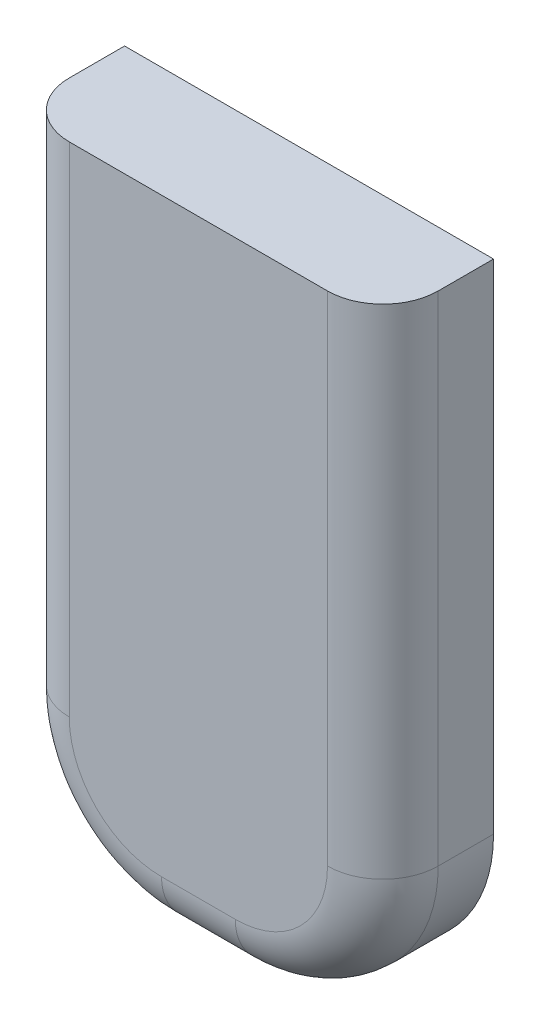
ISO-10303-21;
HEADER;
FILE_DESCRIPTION(('STEP AP214'),'2;1');
FILE_NAME('part.step','',(''),(''),'','','');
FILE_SCHEMA(('AUTOMOTIVE_DESIGN { 1 0 10303 214 1 1 1 1 }'));
ENDSEC;
DATA;
#1=APPLICATION_CONTEXT('core data for automotive mechanical design processes');
#2=APPLICATION_PROTOCOL_DEFINITION('international standard','automotive_design',2000,#1);
#3=PRODUCT_CONTEXT('',#1,'mechanical');
#4=PRODUCT('Part','Part','',(#3));
#5=PRODUCT_RELATED_PRODUCT_CATEGORY('part','',(#4));
#6=PRODUCT_DEFINITION_FORMATION('','',#4);
#7=PRODUCT_DEFINITION_CONTEXT('part definition',#1,'design');
#8=PRODUCT_DEFINITION('design','',#6,#7);
#9=PRODUCT_DEFINITION_SHAPE('','',#8);
#10=(LENGTH_UNIT() NAMED_UNIT(*) SI_UNIT(.MILLI.,.METRE.));
#11=(NAMED_UNIT(*) PLANE_ANGLE_UNIT() SI_UNIT($,.RADIAN.));
#12=(NAMED_UNIT(*) SI_UNIT($,.STERADIAN.) SOLID_ANGLE_UNIT());
#13=UNCERTAINTY_MEASURE_WITH_UNIT(LENGTH_MEASURE(1.E-05),#10,'distance_accuracy_value','');
#14=(GEOMETRIC_REPRESENTATION_CONTEXT(3) GLOBAL_UNCERTAINTY_ASSIGNED_CONTEXT((#13)) GLOBAL_UNIT_ASSIGNED_CONTEXT((#10,
#11,#12)) REPRESENTATION_CONTEXT('',''));
#15=CARTESIAN_POINT('',(0.,0.,0.));
#16=DIRECTION('',(0.,0.,1.));
#17=DIRECTION('',(1.,0.,0.));
#18=AXIS2_PLACEMENT_3D('',#15,#16,#17);
#19=CARTESIAN_POINT('',(58.5858711935382,-125.,6.));
#20=DIRECTION('',(1.,0.,0.));
#21=DIRECTION('',(0.,1.,0.));
#22=AXIS2_PLACEMENT_3D('',#19,#20,#21);
#23=PLANE('',#22);
#24=DIRECTION('',(0.,0.,-1.));
#25=VECTOR('',#24,1.);
#26=CARTESIAN_POINT('',(58.5858711935382,-152.,6.));
#27=LINE('',#26,#25);
#28=CARTESIAN_POINT('',(58.5858711935382,-152.,3.));
#29=VERTEX_POINT('',#28);
#30=CARTESIAN_POINT('',(58.5858711935382,-152.,0.));
#31=VERTEX_POINT('',#30);
#32=EDGE_CURVE('E109',#29,#31,#27,.T.);
#33=ORIENTED_EDGE('',*,*,#32,.F.);
#34=DIRECTION('',(0.,-1.,0.));
#35=VECTOR('',#34,1.);
#36=CARTESIAN_POINT('',(58.5858711935382,-125.,3.));
#37=LINE('',#36,#35);
#38=CARTESIAN_POINT('',(58.5858711935382,-125.,3.));
#39=VERTEX_POINT('',#38);
#40=EDGE_CURVE('E167',#29,#39,#37,.F.);
#41=ORIENTED_EDGE('',*,*,#40,.T.);
#42=DIRECTION('',(0.,0.,-1.));
#43=VECTOR('',#42,1.);
#44=CARTESIAN_POINT('',(58.5858711935382,-125.,6.));
#45=LINE('',#44,#43);
#46=CARTESIAN_POINT('',(58.5858711935382,-125.,0.));
#47=VERTEX_POINT('',#46);
#48=EDGE_CURVE('E131',#39,#47,#45,.T.);
#49=ORIENTED_EDGE('',*,*,#48,.T.);
#50=DIRECTION('',(0.,-1.,0.));
#51=VECTOR('',#50,1.);
#52=CARTESIAN_POINT('',(58.5858711935382,-125.,0.));
#53=LINE('',#52,#51);
#54=EDGE_CURVE('E125',#47,#31,#53,.T.);
#55=ORIENTED_EDGE('',*,*,#54,.T.);
#56=EDGE_LOOP('',(#33,#41,#49,#55));
#57=FACE_BOUND('',#56,.T.);
#58=ADVANCED_FACE('F37',(#57),#23,.F.);
#59=CARTESIAN_POINT('',(66.5858711935382,-152.,6.));
#60=DIRECTION('',(0.,0.,-1.));
#61=DIRECTION('',(-1.,0.,0.));
#62=AXIS2_PLACEMENT_3D('',#59,#60,#61);
#63=CYLINDRICAL_SURFACE('',#62,8.);
#64=DIRECTION('',(0.,0.,-1.));
#65=VECTOR('',#64,1.);
#66=CARTESIAN_POINT('',(66.5858711935383,-160.,6.));
#67=LINE('',#66,#65);
#68=CARTESIAN_POINT('',(66.5858711935383,-160.,3.));
#69=VERTEX_POINT('',#68);
#70=CARTESIAN_POINT('',(66.5858711935383,-160.,0.));
#71=VERTEX_POINT('',#70);
#72=EDGE_CURVE('E119',#69,#71,#67,.T.);
#73=ORIENTED_EDGE('',*,*,#72,.F.);
#74=CARTESIAN_POINT('',(66.5858711935382,-152.,3.));
#75=DIRECTION('',(0.,0.,1.));
#76=DIRECTION('',(1.,0.,0.));
#77=AXIS2_PLACEMENT_3D('',#74,#75,#76);
#78=CIRCLE('',#77,8.);
#79=EDGE_CURVE('E11',#69,#29,#78,.F.);
#80=ORIENTED_EDGE('',*,*,#79,.T.);
#81=ORIENTED_EDGE('',*,*,#32,.T.);
#82=CARTESIAN_POINT('',(66.5858711935382,-152.,0.));
#83=DIRECTION('',(0.,0.,1.));
#84=DIRECTION('',(1.,0.,0.));
#85=AXIS2_PLACEMENT_3D('',#82,#83,#84);
#86=CIRCLE('',#85,8.);
#87=EDGE_CURVE('E112',#31,#71,#86,.T.);
#88=ORIENTED_EDGE('',*,*,#87,.T.);
#89=EDGE_LOOP('',(#73,#80,#81,#88));
#90=FACE_BOUND('',#89,.T.);
#91=ADVANCED_FACE('F111',(#90),#63,.T.);
#92=CARTESIAN_POINT('',(66.5858711935383,-160.,6.));
#93=DIRECTION('',(0.,1.,0.));
#94=DIRECTION('',(0.,0.,1.));
#95=AXIS2_PLACEMENT_3D('',#92,#93,#94);
#96=PLANE('',#95);
#97=DIRECTION('',(0.,0.,-1.));
#98=VECTOR('',#97,1.);
#99=CARTESIAN_POINT('',(70.5858711935382,-160.,6.));
#100=LINE('',#99,#98);
#101=CARTESIAN_POINT('',(70.5858711935382,-160.,3.));
#102=VERTEX_POINT('',#101);
#103=CARTESIAN_POINT('',(70.5858711935382,-160.,0.));
#104=VERTEX_POINT('',#103);
#105=EDGE_CURVE('E154',#102,#104,#100,.T.);
#106=ORIENTED_EDGE('',*,*,#105,.F.);
#107=DIRECTION('',(1.,0.,0.));
#108=VECTOR('',#107,1.);
#109=CARTESIAN_POINT('',(66.5858711935383,-160.,3.));
#110=LINE('',#109,#108);
#111=EDGE_CURVE('E46',#102,#69,#110,.F.);
#112=ORIENTED_EDGE('',*,*,#111,.T.);
#113=ORIENTED_EDGE('',*,*,#72,.T.);
#114=DIRECTION('',(1.,0.,0.));
#115=VECTOR('',#114,1.);
#116=CARTESIAN_POINT('',(66.5858711935383,-160.,0.));
#117=LINE('',#116,#115);
#118=EDGE_CURVE('E128',#71,#104,#117,.T.);
#119=ORIENTED_EDGE('',*,*,#118,.T.);
#120=EDGE_LOOP('',(#106,#112,#113,#119));
#121=FACE_BOUND('',#120,.T.);
#122=ADVANCED_FACE('F228',(#121),#96,.F.);
#123=CARTESIAN_POINT('',(70.5858711935382,-152.,6.));
#124=DIRECTION('',(0.,0.,-1.));
#125=DIRECTION('',(-1.,0.,0.));
#126=AXIS2_PLACEMENT_3D('',#123,#124,#125);
#127=CYLINDRICAL_SURFACE('',#126,8.);
#128=DIRECTION('',(0.,0.,-1.));
#129=VECTOR('',#128,1.);
#130=CARTESIAN_POINT('',(78.5858711935382,-152.,6.));
#131=LINE('',#130,#129);
#132=CARTESIAN_POINT('',(78.5858711935382,-152.,3.));
#133=VERTEX_POINT('',#132);
#134=CARTESIAN_POINT('',(78.5858711935382,-152.,0.));
#135=VERTEX_POINT('',#134);
#136=EDGE_CURVE('E152',#133,#135,#131,.T.);
#137=ORIENTED_EDGE('',*,*,#136,.F.);
#138=CARTESIAN_POINT('',(70.5858711935382,-152.,3.));
#139=DIRECTION('',(0.,0.,1.));
#140=DIRECTION('',(1.,0.,0.));
#141=AXIS2_PLACEMENT_3D('',#138,#139,#140);
#142=CIRCLE('',#141,8.);
#143=EDGE_CURVE('E61',#133,#102,#142,.F.);
#144=ORIENTED_EDGE('',*,*,#143,.T.);
#145=ORIENTED_EDGE('',*,*,#105,.T.);
#146=CARTESIAN_POINT('',(70.5858711935382,-152.,0.));
#147=DIRECTION('',(0.,0.,1.));
#148=DIRECTION('',(1.,0.,0.));
#149=AXIS2_PLACEMENT_3D('',#146,#147,#148);
#150=CIRCLE('',#149,8.);
#151=EDGE_CURVE('E141',#104,#135,#150,.T.);
#152=ORIENTED_EDGE('',*,*,#151,.T.);
#153=EDGE_LOOP('',(#137,#144,#145,#152));
#154=FACE_BOUND('',#153,.T.);
#155=ADVANCED_FACE('F233',(#154),#127,.T.);
#156=CARTESIAN_POINT('',(78.5858711935382,-125.,6.));
#157=DIRECTION('',(-1.,0.,0.));
#158=DIRECTION('',(0.,0.,1.));
#159=AXIS2_PLACEMENT_3D('',#156,#157,#158);
#160=PLANE('',#159);
#161=DIRECTION('',(0.,0.,-1.));
#162=VECTOR('',#161,1.);
#163=CARTESIAN_POINT('',(78.5858711935382,-125.,6.));
#164=LINE('',#163,#162);
#165=CARTESIAN_POINT('',(78.5858711935382,-125.,3.));
#166=VERTEX_POINT('',#165);
#167=CARTESIAN_POINT('',(78.5858711935382,-125.,0.));
#168=VERTEX_POINT('',#167);
#169=EDGE_CURVE('E150',#166,#168,#164,.T.);
#170=ORIENTED_EDGE('',*,*,#169,.F.);
#171=DIRECTION('',(0.,1.,0.));
#172=VECTOR('',#171,1.);
#173=CARTESIAN_POINT('',(78.5858711935382,-152.,3.));
#174=LINE('',#173,#172);
#175=EDGE_CURVE('E173',#166,#133,#174,.F.);
#176=ORIENTED_EDGE('',*,*,#175,.T.);
#177=ORIENTED_EDGE('',*,*,#136,.T.);
#178=DIRECTION('',(0.,1.,0.));
#179=VECTOR('',#178,1.);
#180=CARTESIAN_POINT('',(78.5858711935382,-125.,0.));
#181=LINE('',#180,#179);
#182=EDGE_CURVE('E144',#135,#168,#181,.T.);
#183=ORIENTED_EDGE('',*,*,#182,.T.);
#184=EDGE_LOOP('',(#170,#176,#177,#183));
#185=FACE_BOUND('',#184,.T.);
#186=ADVANCED_FACE('F204',(#185),#160,.F.);
#187=CARTESIAN_POINT('',(58.5858711935382,-125.,6.));
#188=DIRECTION('',(0.,-1.,0.));
#189=DIRECTION('',(0.,0.,-1.));
#190=AXIS2_PLACEMENT_3D('',#187,#188,#189);
#191=PLANE('',#190);
#192=ORIENTED_EDGE('',*,*,#48,.F.);
#193=CARTESIAN_POINT('',(61.5858711935382,-125.,3.));
#194=DIRECTION('',(0.,-1.,0.));
#195=DIRECTION('',(0.,0.,-1.));
#196=AXIS2_PLACEMENT_3D('',#193,#194,#195);
#197=CIRCLE('',#196,3.);
#198=CARTESIAN_POINT('',(61.5858711935382,-125.,6.));
#199=VERTEX_POINT('',#198);
#200=EDGE_CURVE('E171',#39,#199,#197,.F.);
#201=ORIENTED_EDGE('',*,*,#200,.T.);
#202=DIRECTION('',(-1.,0.,0.));
#203=VECTOR('',#202,1.);
#204=CARTESIAN_POINT('',(58.5858711935382,-125.,6.));
#205=LINE('',#204,#203);
#206=CARTESIAN_POINT('',(75.5858711935382,-125.,6.));
#207=VERTEX_POINT('',#206);
#208=EDGE_CURVE('E137',#207,#199,#205,.T.);
#209=ORIENTED_EDGE('',*,*,#208,.F.);
#210=CARTESIAN_POINT('',(75.5858711935382,-125.,3.));
#211=DIRECTION('',(0.,-1.,0.));
#212=DIRECTION('',(0.,0.,-1.));
#213=AXIS2_PLACEMENT_3D('',#210,#211,#212);
#214=CIRCLE('',#213,3.);
#215=EDGE_CURVE('E169',#207,#166,#214,.F.);
#216=ORIENTED_EDGE('',*,*,#215,.T.);
#217=ORIENTED_EDGE('',*,*,#169,.T.);
#218=DIRECTION('',(-1.,0.,0.));
#219=VECTOR('',#218,1.);
#220=CARTESIAN_POINT('',(58.5858711935382,-125.,0.));
#221=LINE('',#220,#219);
#222=EDGE_CURVE('E147',#168,#47,#221,.T.);
#223=ORIENTED_EDGE('',*,*,#222,.T.);
#224=EDGE_LOOP('',(#192,#201,#209,#216,#217,#223));
#225=FACE_BOUND('',#224,.T.);
#226=ADVANCED_FACE('F202',(#225),#191,.F.);
#227=CARTESIAN_POINT('',(66.5858711935382,-152.,6.));
#228=DIRECTION('',(0.,0.,1.));
#229=DIRECTION('',(1.,0.,0.));
#230=AXIS2_PLACEMENT_3D('',#227,#228,#229);
#231=PLANE('',#230);
#232=ORIENTED_EDGE('',*,*,#208,.T.);
#233=DIRECTION('',(0.,-1.,0.));
#234=VECTOR('',#233,1.);
#235=CARTESIAN_POINT('',(61.5858711935382,-152.,6.));
#236=LINE('',#235,#234);
#237=CARTESIAN_POINT('',(61.5858711935382,-152.,6.));
#238=VERTEX_POINT('',#237);
#239=EDGE_CURVE('E164',#199,#238,#236,.T.);
#240=ORIENTED_EDGE('',*,*,#239,.T.);
#241=CARTESIAN_POINT('',(66.5858711935382,-152.,6.));
#242=DIRECTION('',(0.,0.,1.));
#243=DIRECTION('',(1.,0.,0.));
#244=AXIS2_PLACEMENT_3D('',#241,#242,#243);
#245=CIRCLE('',#244,5.);
#246=CARTESIAN_POINT('',(66.5858711935383,-157.,6.));
#247=VERTEX_POINT('',#246);
#248=EDGE_CURVE('E118',#238,#247,#245,.T.);
#249=ORIENTED_EDGE('',*,*,#248,.T.);
#250=DIRECTION('',(1.,0.,0.));
#251=VECTOR('',#250,1.);
#252=CARTESIAN_POINT('',(70.5858711935382,-157.,6.));
#253=LINE('',#252,#251);
#254=CARTESIAN_POINT('',(70.5858711935382,-157.,6.));
#255=VERTEX_POINT('',#254);
#256=EDGE_CURVE('E158',#247,#255,#253,.T.);
#257=ORIENTED_EDGE('',*,*,#256,.T.);
#258=CARTESIAN_POINT('',(70.5858711935382,-152.,6.));
#259=DIRECTION('',(0.,0.,1.));
#260=DIRECTION('',(1.,0.,0.));
#261=AXIS2_PLACEMENT_3D('',#258,#259,#260);
#262=CIRCLE('',#261,5.);
#263=CARTESIAN_POINT('',(75.5858711935382,-152.,6.));
#264=VERTEX_POINT('',#263);
#265=EDGE_CURVE('E160',#255,#264,#262,.T.);
#266=ORIENTED_EDGE('',*,*,#265,.T.);
#267=DIRECTION('',(0.,1.,0.));
#268=VECTOR('',#267,1.);
#269=CARTESIAN_POINT('',(75.5858711935382,-125.,6.));
#270=LINE('',#269,#268);
#271=EDGE_CURVE('E162',#264,#207,#270,.T.);
#272=ORIENTED_EDGE('',*,*,#271,.T.);
#273=EDGE_LOOP('',(#232,#240,#249,#257,#266,#272));
#274=FACE_BOUND('',#273,.T.);
#275=ADVANCED_FACE('F195',(#274),#231,.T.);
#276=CARTESIAN_POINT('',(66.5858711935382,-152.,0.));
#277=DIRECTION('',(0.,0.,1.));
#278=DIRECTION('',(1.,0.,0.));
#279=AXIS2_PLACEMENT_3D('',#276,#277,#278);
#280=PLANE('',#279);
#281=CARTESIAN_POINT('',(68.5858711935382,-149.,0.));
#282=DIRECTION('',(0.,0.,-1.));
#283=DIRECTION('',(-1.,0.,0.));
#284=AXIS2_PLACEMENT_3D('',#281,#282,#283);
#285=CIRCLE('',#284,7.5);
#286=CARTESIAN_POINT('',(61.0858711935382,-149.,0.));
#287=VERTEX_POINT('',#286);
#288=EDGE_CURVE('E255',#287,#287,#285,.T.);
#289=ORIENTED_EDGE('',*,*,#288,.F.);
#290=EDGE_LOOP('',(#289));
#291=FACE_BOUND('',#290,.T.);
#292=ORIENTED_EDGE('',*,*,#54,.F.);
#293=ORIENTED_EDGE('',*,*,#222,.F.);
#294=ORIENTED_EDGE('',*,*,#182,.F.);
#295=ORIENTED_EDGE('',*,*,#151,.F.);
#296=ORIENTED_EDGE('',*,*,#118,.F.);
#297=ORIENTED_EDGE('',*,*,#87,.F.);
#298=EDGE_LOOP('',(#292,#293,#294,#295,#296,#297));
#299=FACE_BOUND('',#298,.T.);
#300=ADVANCED_FACE('F123',(#291,#299),#280,.F.);
#301=CARTESIAN_POINT('',(75.5858711935382,-152.,3.));
#302=DIRECTION('',(0.,-1.,0.));
#303=DIRECTION('',(0.,0.,-1.));
#304=AXIS2_PLACEMENT_3D('',#301,#302,#303);
#305=CYLINDRICAL_SURFACE('',#304,3.);
#306=ORIENTED_EDGE('',*,*,#215,.F.);
#307=ORIENTED_EDGE('',*,*,#271,.F.);
#308=CARTESIAN_POINT('',(75.5858711935382,-152.,3.));
#309=DIRECTION('',(0.,-1.,0.));
#310=DIRECTION('',(0.,0.,-1.));
#311=AXIS2_PLACEMENT_3D('',#308,#309,#310);
#312=CIRCLE('',#311,3.);
#313=EDGE_CURVE('E41',#133,#264,#312,.T.);
#314=ORIENTED_EDGE('',*,*,#313,.F.);
#315=ORIENTED_EDGE('',*,*,#175,.F.);
#316=EDGE_LOOP('',(#306,#307,#314,#315));
#317=FACE_BOUND('',#316,.T.);
#318=ADVANCED_FACE('F39',(#317),#305,.T.);
#319=CARTESIAN_POINT('',(70.5858711935382,-152.,3.));
#320=DIRECTION('',(0.,0.,1.));
#321=DIRECTION('',(1.,0.,0.));
#322=AXIS2_PLACEMENT_3D('',#319,#320,#321);
#323=TOROIDAL_SURFACE('',#322,5.,3.);
#324=ORIENTED_EDGE('',*,*,#313,.T.);
#325=ORIENTED_EDGE('',*,*,#265,.F.);
#326=CARTESIAN_POINT('',(70.5858711935382,-157.,3.));
#327=DIRECTION('',(-1.,0.,0.));
#328=DIRECTION('',(0.,-1.,0.));
#329=AXIS2_PLACEMENT_3D('',#326,#327,#328);
#330=CIRCLE('',#329,3.);
#331=EDGE_CURVE('E135',#102,#255,#330,.T.);
#332=ORIENTED_EDGE('',*,*,#331,.F.);
#333=ORIENTED_EDGE('',*,*,#143,.F.);
#334=EDGE_LOOP('',(#324,#325,#332,#333));
#335=FACE_BOUND('',#334,.T.);
#336=ADVANCED_FACE('F190',(#335),#323,.T.);
#337=CARTESIAN_POINT('',(66.5858711935382,-157.,3.));
#338=DIRECTION('',(-1.,0.,0.));
#339=DIRECTION('',(0.,0.,1.));
#340=AXIS2_PLACEMENT_3D('',#337,#338,#339);
#341=CYLINDRICAL_SURFACE('',#340,3.);
#342=ORIENTED_EDGE('',*,*,#331,.T.);
#343=ORIENTED_EDGE('',*,*,#256,.F.);
#344=CARTESIAN_POINT('',(66.5858711935383,-157.,3.));
#345=DIRECTION('',(-1.,0.,0.));
#346=DIRECTION('',(0.,0.,1.));
#347=AXIS2_PLACEMENT_3D('',#344,#345,#346);
#348=CIRCLE('',#347,3.);
#349=EDGE_CURVE('E179',#69,#247,#348,.T.);
#350=ORIENTED_EDGE('',*,*,#349,.F.);
#351=ORIENTED_EDGE('',*,*,#111,.F.);
#352=EDGE_LOOP('',(#342,#343,#350,#351));
#353=FACE_BOUND('',#352,.T.);
#354=ADVANCED_FACE('F186',(#353),#341,.T.);
#355=CARTESIAN_POINT('',(66.5858711935382,-152.,3.));
#356=DIRECTION('',(0.,0.,1.));
#357=DIRECTION('',(1.,0.,0.));
#358=AXIS2_PLACEMENT_3D('',#355,#356,#357);
#359=TOROIDAL_SURFACE('',#358,5.,3.);
#360=ORIENTED_EDGE('',*,*,#349,.T.);
#361=ORIENTED_EDGE('',*,*,#248,.F.);
#362=CARTESIAN_POINT('',(61.5858711935382,-152.,3.));
#363=DIRECTION('',(0.,1.,0.));
#364=DIRECTION('',(0.,0.,1.));
#365=AXIS2_PLACEMENT_3D('',#362,#363,#364);
#366=CIRCLE('',#365,3.);
#367=EDGE_CURVE('E177',#29,#238,#366,.T.);
#368=ORIENTED_EDGE('',*,*,#367,.F.);
#369=ORIENTED_EDGE('',*,*,#79,.F.);
#370=EDGE_LOOP('',(#360,#361,#368,#369));
#371=FACE_BOUND('',#370,.T.);
#372=ADVANCED_FACE('F213',(#371),#359,.T.);
#373=CARTESIAN_POINT('',(61.5858711935382,-152.,3.));
#374=DIRECTION('',(0.,1.,0.));
#375=DIRECTION('',(-1.,0.,0.));
#376=AXIS2_PLACEMENT_3D('',#373,#374,#375);
#377=CYLINDRICAL_SURFACE('',#376,3.);
#378=ORIENTED_EDGE('',*,*,#200,.F.);
#379=ORIENTED_EDGE('',*,*,#40,.F.);
#380=ORIENTED_EDGE('',*,*,#367,.T.);
#381=ORIENTED_EDGE('',*,*,#239,.F.);
#382=EDGE_LOOP('',(#378,#379,#380,#381));
#383=FACE_BOUND('',#382,.T.);
#384=ADVANCED_FACE('F209',(#383),#377,.T.);
#385=CARTESIAN_POINT('',(68.5858711935382,-149.,4.));
#386=DIRECTION('',(0.,0.,-1.));
#387=DIRECTION('',(-1.,0.,0.));
#388=AXIS2_PLACEMENT_3D('',#385,#386,#387);
#389=CYLINDRICAL_SURFACE('',#388,7.5);
#390=CARTESIAN_POINT('',(68.5858711935382,-149.,4.));
#391=DIRECTION('',(0.,0.,-1.));
#392=DIRECTION('',(-1.,0.,0.));
#393=AXIS2_PLACEMENT_3D('',#390,#391,#392);
#394=CIRCLE('',#393,7.5);
#395=CARTESIAN_POINT('',(61.0858711935382,-149.,4.));
#396=VERTEX_POINT('',#395);
#397=EDGE_CURVE('E180',#396,#396,#394,.T.);
#398=ORIENTED_EDGE('',*,*,#397,.F.);
#399=EDGE_LOOP('',(#398));
#400=FACE_BOUND('',#399,.T.);
#401=ORIENTED_EDGE('',*,*,#288,.T.);
#402=EDGE_LOOP('',(#401));
#403=FACE_BOUND('',#402,.T.);
#404=ADVANCED_FACE('F220',(#400,#403),#389,.F.);
#405=CARTESIAN_POINT('',(68.5858711935382,-149.,4.));
#406=DIRECTION('',(0.,0.,-1.));
#407=DIRECTION('',(-1.,0.,0.));
#408=AXIS2_PLACEMENT_3D('',#405,#406,#407);
#409=PLANE('',#408);
#410=ORIENTED_EDGE('',*,*,#397,.T.);
#411=EDGE_LOOP('',(#410));
#412=FACE_BOUND('',#411,.T.);
#413=ADVANCED_FACE('F247',(#412),#409,.T.);
#414=CLOSED_SHELL('',(#58,#91,#122,#155,#186,#226,#275,#300,#318,#336,#354,#372,#384,#404,#413));
#415=MANIFOLD_SOLID_BREP('B2',#414);
#416=ADVANCED_BREP_SHAPE_REPRESENTATION('',(#18,#415),#14);
#417=SHAPE_DEFINITION_REPRESENTATION(#9,#416);
ENDSEC;
END-ISO-10303-21;
